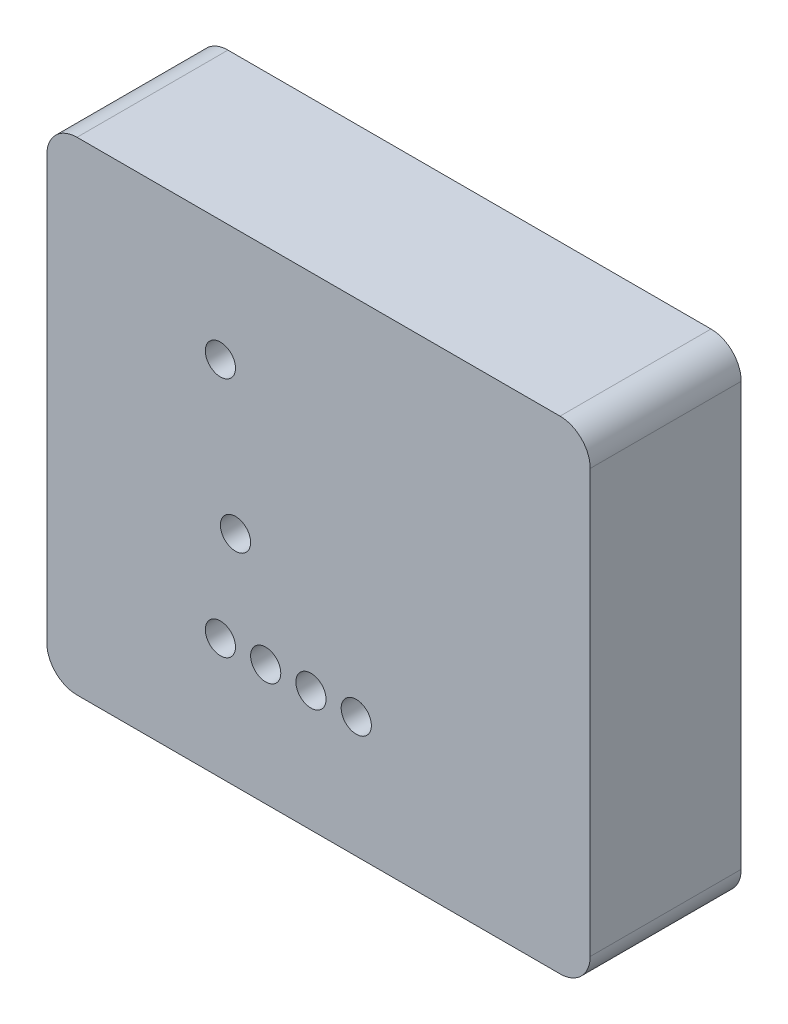
ISO-10303-21;
HEADER;
FILE_DESCRIPTION(('STEP AP214'),'2;1');
FILE_NAME('part.step','',(''),(''),'','','');
FILE_SCHEMA(('AUTOMOTIVE_DESIGN { 1 0 10303 214 1 1 1 1 }'));
ENDSEC;
DATA;
#1=APPLICATION_CONTEXT('core data for automotive mechanical design processes');
#2=APPLICATION_PROTOCOL_DEFINITION('international standard','automotive_design',2000,#1);
#3=PRODUCT_CONTEXT('',#1,'mechanical');
#4=PRODUCT('Part','Part','',(#3));
#5=PRODUCT_RELATED_PRODUCT_CATEGORY('part','',(#4));
#6=PRODUCT_DEFINITION_FORMATION('','',#4);
#7=PRODUCT_DEFINITION_CONTEXT('part definition',#1,'design');
#8=PRODUCT_DEFINITION('design','',#6,#7);
#9=PRODUCT_DEFINITION_SHAPE('','',#8);
#10=(LENGTH_UNIT() NAMED_UNIT(*) SI_UNIT(.MILLI.,.METRE.));
#11=(NAMED_UNIT(*) PLANE_ANGLE_UNIT() SI_UNIT($,.RADIAN.));
#12=(NAMED_UNIT(*) SI_UNIT($,.STERADIAN.) SOLID_ANGLE_UNIT());
#13=UNCERTAINTY_MEASURE_WITH_UNIT(LENGTH_MEASURE(1.E-05),#10,'distance_accuracy_value','');
#14=(GEOMETRIC_REPRESENTATION_CONTEXT(3) GLOBAL_UNCERTAINTY_ASSIGNED_CONTEXT((#13)) GLOBAL_UNIT_ASSIGNED_CONTEXT((#10,
#11,#12)) REPRESENTATION_CONTEXT('',''));
#15=CARTESIAN_POINT('',(0.,0.,0.));
#16=DIRECTION('',(0.,0.,1.));
#17=DIRECTION('',(1.,0.,0.));
#18=AXIS2_PLACEMENT_3D('',#15,#16,#17);
#19=CARTESIAN_POINT('',(0.,0.,5.));
#20=DIRECTION('',(0.,0.,-1.));
#21=DIRECTION('',(-1.,0.,0.));
#22=AXIS2_PLACEMENT_3D('',#19,#20,#21);
#23=PLANE('',#22);
#24=CARTESIAN_POINT('',(5.75,12.,5.));
#25=DIRECTION('',(0.,0.,1.));
#26=DIRECTION('',(1.,0.,0.));
#27=AXIS2_PLACEMENT_3D('',#24,#25,#26);
#28=CIRCLE('',#27,0.500000000000001);
#29=CARTESIAN_POINT('',(6.25,12.,5.));
#30=VERTEX_POINT('',#29);
#31=EDGE_CURVE('E199',#30,#30,#28,.T.);
#32=ORIENTED_EDGE('',*,*,#31,.F.);
#33=EDGE_LOOP('',(#32));
#34=FACE_BOUND('',#33,.T.);
#35=CARTESIAN_POINT('',(8.75,4.,5.));
#36=DIRECTION('',(0.,0.,1.));
#37=DIRECTION('',(1.,0.,0.));
#38=AXIS2_PLACEMENT_3D('',#35,#36,#37);
#39=CIRCLE('',#38,0.500000000000001);
#40=CARTESIAN_POINT('',(9.25,4.,5.));
#41=VERTEX_POINT('',#40);
#42=EDGE_CURVE('E187',#41,#41,#39,.T.);
#43=ORIENTED_EDGE('',*,*,#42,.F.);
#44=EDGE_LOOP('',(#43));
#45=FACE_BOUND('',#44,.T.);
#46=CARTESIAN_POINT('',(5.75,4.,5.));
#47=DIRECTION('',(0.,0.,1.));
#48=DIRECTION('',(1.,0.,0.));
#49=AXIS2_PLACEMENT_3D('',#46,#47,#48);
#50=CIRCLE('',#49,0.500000000000001);
#51=CARTESIAN_POINT('',(6.25,4.,5.));
#52=VERTEX_POINT('',#51);
#53=EDGE_CURVE('E120',#52,#52,#50,.T.);
#54=ORIENTED_EDGE('',*,*,#53,.F.);
#55=EDGE_LOOP('',(#54));
#56=FACE_BOUND('',#55,.T.);
#57=DIRECTION('',(1.,0.,0.));
#58=VECTOR('',#57,1.);
#59=CARTESIAN_POINT('',(0.,0.,5.));
#60=LINE('',#59,#58);
#61=CARTESIAN_POINT('',(1.,0.,5.));
#62=VERTEX_POINT('',#61);
#63=CARTESIAN_POINT('',(17.,0.,5.));
#64=VERTEX_POINT('',#63);
#65=EDGE_CURVE('E110',#62,#64,#60,.T.);
#66=ORIENTED_EDGE('',*,*,#65,.T.);
#67=CARTESIAN_POINT('',(17.,1.,5.));
#68=DIRECTION('',(0.,0.,-1.));
#69=DIRECTION('',(-1.,0.,0.));
#70=AXIS2_PLACEMENT_3D('',#67,#68,#69);
#71=CIRCLE('',#70,1.);
#72=CARTESIAN_POINT('',(18.,1.,5.));
#73=VERTEX_POINT('',#72);
#74=EDGE_CURVE('E11',#64,#73,#71,.F.);
#75=ORIENTED_EDGE('',*,*,#74,.T.);
#76=DIRECTION('',(0.,1.,0.));
#77=VECTOR('',#76,1.);
#78=CARTESIAN_POINT('',(18.,0.,5.));
#79=LINE('',#78,#77);
#80=CARTESIAN_POINT('',(18.,15.,5.));
#81=VERTEX_POINT('',#80);
#82=EDGE_CURVE('E158',#73,#81,#79,.T.);
#83=ORIENTED_EDGE('',*,*,#82,.T.);
#84=CARTESIAN_POINT('',(17.,15.,5.));
#85=DIRECTION('',(0.,0.,-1.));
#86=DIRECTION('',(-1.,0.,0.));
#87=AXIS2_PLACEMENT_3D('',#84,#85,#86);
#88=CIRCLE('',#87,1.);
#89=CARTESIAN_POINT('',(17.,16.,5.));
#90=VERTEX_POINT('',#89);
#91=EDGE_CURVE('E149',#81,#90,#88,.F.);
#92=ORIENTED_EDGE('',*,*,#91,.T.);
#93=DIRECTION('',(-1.,0.,0.));
#94=VECTOR('',#93,1.);
#95=CARTESIAN_POINT('',(0.,16.,5.));
#96=LINE('',#95,#94);
#97=CARTESIAN_POINT('',(1.,16.,5.));
#98=VERTEX_POINT('',#97);
#99=EDGE_CURVE('E111',#90,#98,#96,.T.);
#100=ORIENTED_EDGE('',*,*,#99,.T.);
#101=CARTESIAN_POINT('',(1.,15.,5.));
#102=DIRECTION('',(0.,0.,-1.));
#103=DIRECTION('',(-1.,0.,0.));
#104=AXIS2_PLACEMENT_3D('',#101,#102,#103);
#105=CIRCLE('',#104,1.);
#106=CARTESIAN_POINT('',(0.,15.,5.));
#107=VERTEX_POINT('',#106);
#108=EDGE_CURVE('E138',#98,#107,#105,.F.);
#109=ORIENTED_EDGE('',*,*,#108,.T.);
#110=DIRECTION('',(0.,-1.,0.));
#111=VECTOR('',#110,1.);
#112=CARTESIAN_POINT('',(0.,0.,5.));
#113=LINE('',#112,#111);
#114=CARTESIAN_POINT('',(0.,1.,5.));
#115=VERTEX_POINT('',#114);
#116=EDGE_CURVE('E124',#107,#115,#113,.T.);
#117=ORIENTED_EDGE('',*,*,#116,.T.);
#118=CARTESIAN_POINT('',(1.,1.,5.));
#119=DIRECTION('',(0.,0.,-1.));
#120=DIRECTION('',(-1.,0.,0.));
#121=AXIS2_PLACEMENT_3D('',#118,#119,#120);
#122=CIRCLE('',#121,1.);
#123=EDGE_CURVE('E127',#115,#62,#122,.F.);
#124=ORIENTED_EDGE('',*,*,#123,.T.);
#125=EDGE_LOOP('',(#66,#75,#83,#92,#100,#109,#117,#124));
#126=FACE_BOUND('',#125,.T.);
#127=CARTESIAN_POINT('',(7.25,4.,5.));
#128=DIRECTION('',(0.,0.,1.));
#129=DIRECTION('',(1.,0.,0.));
#130=AXIS2_PLACEMENT_3D('',#127,#128,#129);
#131=CIRCLE('',#130,0.5);
#132=CARTESIAN_POINT('',(7.75,4.,5.));
#133=VERTEX_POINT('',#132);
#134=EDGE_CURVE('E181',#133,#133,#131,.T.);
#135=ORIENTED_EDGE('',*,*,#134,.F.);
#136=EDGE_LOOP('',(#135));
#137=FACE_BOUND('',#136,.T.);
#138=CARTESIAN_POINT('',(10.25,4.,5.));
#139=DIRECTION('',(0.,0.,1.));
#140=DIRECTION('',(1.,0.,0.));
#141=AXIS2_PLACEMENT_3D('',#138,#139,#140);
#142=CIRCLE('',#141,0.500000000000001);
#143=CARTESIAN_POINT('',(10.75,4.,5.));
#144=VERTEX_POINT('',#143);
#145=EDGE_CURVE('E193',#144,#144,#142,.T.);
#146=ORIENTED_EDGE('',*,*,#145,.F.);
#147=EDGE_LOOP('',(#146));
#148=FACE_BOUND('',#147,.T.);
#149=CARTESIAN_POINT('',(6.25,7.25,5.));
#150=DIRECTION('',(0.,0.,1.));
#151=DIRECTION('',(1.,0.,0.));
#152=AXIS2_PLACEMENT_3D('',#149,#150,#151);
#153=CIRCLE('',#152,0.500000000000001);
#154=CARTESIAN_POINT('',(6.75,7.25,5.));
#155=VERTEX_POINT('',#154);
#156=EDGE_CURVE('E205',#155,#155,#153,.T.);
#157=ORIENTED_EDGE('',*,*,#156,.F.);
#158=EDGE_LOOP('',(#157));
#159=FACE_BOUND('',#158,.T.);
#160=ADVANCED_FACE('F33',(#34,#45,#56,#126,#137,#148,#159),#23,.F.);
#161=CARTESIAN_POINT('',(0.,0.,0.));
#162=DIRECTION('',(0.,0.,-1.));
#163=DIRECTION('',(-1.,0.,0.));
#164=AXIS2_PLACEMENT_3D('',#161,#162,#163);
#165=PLANE('',#164);
#166=CARTESIAN_POINT('',(5.75,12.,0.));
#167=DIRECTION('',(0.,0.,1.));
#168=DIRECTION('',(1.,0.,0.));
#169=AXIS2_PLACEMENT_3D('',#166,#167,#168);
#170=CIRCLE('',#169,0.500000000000001);
#171=CARTESIAN_POINT('',(6.25,12.,0.));
#172=VERTEX_POINT('',#171);
#173=EDGE_CURVE('E202',#172,#172,#170,.T.);
#174=ORIENTED_EDGE('',*,*,#173,.T.);
#175=EDGE_LOOP('',(#174));
#176=FACE_BOUND('',#175,.T.);
#177=CARTESIAN_POINT('',(8.75,4.,0.));
#178=DIRECTION('',(0.,0.,1.));
#179=DIRECTION('',(1.,0.,0.));
#180=AXIS2_PLACEMENT_3D('',#177,#178,#179);
#181=CIRCLE('',#180,0.500000000000001);
#182=CARTESIAN_POINT('',(9.25,4.,0.));
#183=VERTEX_POINT('',#182);
#184=EDGE_CURVE('E190',#183,#183,#181,.T.);
#185=ORIENTED_EDGE('',*,*,#184,.T.);
#186=EDGE_LOOP('',(#185));
#187=FACE_BOUND('',#186,.T.);
#188=CARTESIAN_POINT('',(5.75,4.,0.));
#189=DIRECTION('',(0.,0.,1.));
#190=DIRECTION('',(1.,0.,0.));
#191=AXIS2_PLACEMENT_3D('',#188,#189,#190);
#192=CIRCLE('',#191,0.500000000000001);
#193=CARTESIAN_POINT('',(6.25,4.,0.));
#194=VERTEX_POINT('',#193);
#195=EDGE_CURVE('E178',#194,#194,#192,.T.);
#196=ORIENTED_EDGE('',*,*,#195,.T.);
#197=EDGE_LOOP('',(#196));
#198=FACE_BOUND('',#197,.T.);
#199=DIRECTION('',(0.,1.,0.));
#200=VECTOR('',#199,1.);
#201=CARTESIAN_POINT('',(18.,0.,0.));
#202=LINE('',#201,#200);
#203=CARTESIAN_POINT('',(18.,1.,0.));
#204=VERTEX_POINT('',#203);
#205=CARTESIAN_POINT('',(18.,15.,0.));
#206=VERTEX_POINT('',#205);
#207=EDGE_CURVE('E115',#204,#206,#202,.T.);
#208=ORIENTED_EDGE('',*,*,#207,.F.);
#209=CARTESIAN_POINT('',(17.,1.,0.));
#210=DIRECTION('',(0.,0.,-1.));
#211=DIRECTION('',(-1.,0.,0.));
#212=AXIS2_PLACEMENT_3D('',#209,#210,#211);
#213=CIRCLE('',#212,1.);
#214=CARTESIAN_POINT('',(17.,0.,0.));
#215=VERTEX_POINT('',#214);
#216=EDGE_CURVE('E55',#204,#215,#213,.T.);
#217=ORIENTED_EDGE('',*,*,#216,.T.);
#218=DIRECTION('',(1.,0.,0.));
#219=VECTOR('',#218,1.);
#220=CARTESIAN_POINT('',(0.,0.,0.));
#221=LINE('',#220,#219);
#222=CARTESIAN_POINT('',(1.,0.,0.));
#223=VERTEX_POINT('',#222);
#224=EDGE_CURVE('E109',#223,#215,#221,.T.);
#225=ORIENTED_EDGE('',*,*,#224,.F.);
#226=CARTESIAN_POINT('',(1.,1.,0.));
#227=DIRECTION('',(0.,0.,-1.));
#228=DIRECTION('',(-1.,0.,0.));
#229=AXIS2_PLACEMENT_3D('',#226,#227,#228);
#230=CIRCLE('',#229,1.);
#231=CARTESIAN_POINT('',(0.,1.,0.));
#232=VERTEX_POINT('',#231);
#233=EDGE_CURVE('E99',#223,#232,#230,.T.);
#234=ORIENTED_EDGE('',*,*,#233,.T.);
#235=DIRECTION('',(0.,-1.,0.));
#236=VECTOR('',#235,1.);
#237=CARTESIAN_POINT('',(0.,0.,0.));
#238=LINE('',#237,#236);
#239=CARTESIAN_POINT('',(0.,15.,0.));
#240=VERTEX_POINT('',#239);
#241=EDGE_CURVE('E116',#240,#232,#238,.T.);
#242=ORIENTED_EDGE('',*,*,#241,.F.);
#243=CARTESIAN_POINT('',(1.,15.,0.));
#244=DIRECTION('',(0.,0.,-1.));
#245=DIRECTION('',(-1.,0.,0.));
#246=AXIS2_PLACEMENT_3D('',#243,#244,#245);
#247=CIRCLE('',#246,1.);
#248=CARTESIAN_POINT('',(1.,16.,0.));
#249=VERTEX_POINT('',#248);
#250=EDGE_CURVE('E132',#240,#249,#247,.T.);
#251=ORIENTED_EDGE('',*,*,#250,.T.);
#252=DIRECTION('',(-1.,0.,0.));
#253=VECTOR('',#252,1.);
#254=CARTESIAN_POINT('',(0.,16.,0.));
#255=LINE('',#254,#253);
#256=CARTESIAN_POINT('',(17.,16.,0.));
#257=VERTEX_POINT('',#256);
#258=EDGE_CURVE('E118',#257,#249,#255,.T.);
#259=ORIENTED_EDGE('',*,*,#258,.F.);
#260=CARTESIAN_POINT('',(17.,15.,0.));
#261=DIRECTION('',(0.,0.,-1.));
#262=DIRECTION('',(-1.,0.,0.));
#263=AXIS2_PLACEMENT_3D('',#260,#261,#262);
#264=CIRCLE('',#263,1.);
#265=EDGE_CURVE('E143',#257,#206,#264,.T.);
#266=ORIENTED_EDGE('',*,*,#265,.T.);
#267=EDGE_LOOP('',(#208,#217,#225,#234,#242,#251,#259,#266));
#268=FACE_BOUND('',#267,.T.);
#269=CARTESIAN_POINT('',(7.25,4.,0.));
#270=DIRECTION('',(0.,0.,1.));
#271=DIRECTION('',(1.,0.,0.));
#272=AXIS2_PLACEMENT_3D('',#269,#270,#271);
#273=CIRCLE('',#272,0.5);
#274=CARTESIAN_POINT('',(7.75,4.,0.));
#275=VERTEX_POINT('',#274);
#276=EDGE_CURVE('E184',#275,#275,#273,.T.);
#277=ORIENTED_EDGE('',*,*,#276,.T.);
#278=EDGE_LOOP('',(#277));
#279=FACE_BOUND('',#278,.T.);
#280=CARTESIAN_POINT('',(10.25,4.,0.));
#281=DIRECTION('',(0.,0.,1.));
#282=DIRECTION('',(1.,0.,0.));
#283=AXIS2_PLACEMENT_3D('',#280,#281,#282);
#284=CIRCLE('',#283,0.500000000000001);
#285=CARTESIAN_POINT('',(10.75,4.,0.));
#286=VERTEX_POINT('',#285);
#287=EDGE_CURVE('E196',#286,#286,#284,.T.);
#288=ORIENTED_EDGE('',*,*,#287,.T.);
#289=EDGE_LOOP('',(#288));
#290=FACE_BOUND('',#289,.T.);
#291=CARTESIAN_POINT('',(6.25,7.25,0.));
#292=DIRECTION('',(0.,0.,1.));
#293=DIRECTION('',(1.,0.,0.));
#294=AXIS2_PLACEMENT_3D('',#291,#292,#293);
#295=CIRCLE('',#294,0.500000000000001);
#296=CARTESIAN_POINT('',(6.75,7.25,0.));
#297=VERTEX_POINT('',#296);
#298=EDGE_CURVE('E208',#297,#297,#295,.T.);
#299=ORIENTED_EDGE('',*,*,#298,.T.);
#300=EDGE_LOOP('',(#299));
#301=FACE_BOUND('',#300,.T.);
#302=ADVANCED_FACE('F113',(#176,#187,#198,#268,#279,#290,#301),#165,.T.);
#303=CARTESIAN_POINT('',(0.,0.,5.));
#304=DIRECTION('',(1.,0.,0.));
#305=DIRECTION('',(0.,0.,-1.));
#306=AXIS2_PLACEMENT_3D('',#303,#304,#305);
#307=PLANE('',#306);
#308=ORIENTED_EDGE('',*,*,#116,.F.);
#309=DIRECTION('',(0.,0.,-1.));
#310=VECTOR('',#309,1.);
#311=CARTESIAN_POINT('',(0.,15.,5.));
#312=LINE('',#311,#310);
#313=EDGE_CURVE('E129',#107,#240,#312,.T.);
#314=ORIENTED_EDGE('',*,*,#313,.T.);
#315=ORIENTED_EDGE('',*,*,#241,.T.);
#316=DIRECTION('',(0.,0.,-1.));
#317=VECTOR('',#316,1.);
#318=CARTESIAN_POINT('',(0.,1.,5.));
#319=LINE('',#318,#317);
#320=EDGE_CURVE('E105',#232,#115,#319,.F.);
#321=ORIENTED_EDGE('',*,*,#320,.T.);
#322=EDGE_LOOP('',(#308,#314,#315,#321));
#323=FACE_BOUND('',#322,.T.);
#324=ADVANCED_FACE('F223',(#323),#307,.F.);
#325=CARTESIAN_POINT('',(0.,0.,5.));
#326=DIRECTION('',(0.,1.,0.));
#327=DIRECTION('',(0.,0.,1.));
#328=AXIS2_PLACEMENT_3D('',#325,#326,#327);
#329=PLANE('',#328);
#330=ORIENTED_EDGE('',*,*,#224,.T.);
#331=DIRECTION('',(0.,0.,-1.));
#332=VECTOR('',#331,1.);
#333=CARTESIAN_POINT('',(17.,0.,5.));
#334=LINE('',#333,#332);
#335=EDGE_CURVE('E41',#215,#64,#334,.F.);
#336=ORIENTED_EDGE('',*,*,#335,.T.);
#337=ORIENTED_EDGE('',*,*,#65,.F.);
#338=DIRECTION('',(0.,0.,-1.));
#339=VECTOR('',#338,1.);
#340=CARTESIAN_POINT('',(1.,0.,5.));
#341=LINE('',#340,#339);
#342=EDGE_CURVE('E103',#62,#223,#341,.T.);
#343=ORIENTED_EDGE('',*,*,#342,.T.);
#344=EDGE_LOOP('',(#330,#336,#337,#343));
#345=FACE_BOUND('',#344,.T.);
#346=ADVANCED_FACE('F108',(#345),#329,.F.);
#347=CARTESIAN_POINT('',(18.,0.,5.));
#348=DIRECTION('',(-1.,0.,0.));
#349=DIRECTION('',(0.,0.,1.));
#350=AXIS2_PLACEMENT_3D('',#347,#348,#349);
#351=PLANE('',#350);
#352=ORIENTED_EDGE('',*,*,#82,.F.);
#353=DIRECTION('',(0.,0.,-1.));
#354=VECTOR('',#353,1.);
#355=CARTESIAN_POINT('',(18.,1.,5.));
#356=LINE('',#355,#354);
#357=EDGE_CURVE('E151',#73,#204,#356,.T.);
#358=ORIENTED_EDGE('',*,*,#357,.T.);
#359=ORIENTED_EDGE('',*,*,#207,.T.);
#360=DIRECTION('',(0.,0.,-1.));
#361=VECTOR('',#360,1.);
#362=CARTESIAN_POINT('',(18.,15.,5.));
#363=LINE('',#362,#361);
#364=EDGE_CURVE('E146',#206,#81,#363,.F.);
#365=ORIENTED_EDGE('',*,*,#364,.T.);
#366=EDGE_LOOP('',(#352,#358,#359,#365));
#367=FACE_BOUND('',#366,.T.);
#368=ADVANCED_FACE('F157',(#367),#351,.F.);
#369=CARTESIAN_POINT('',(0.,16.,5.));
#370=DIRECTION('',(0.,-1.,0.));
#371=DIRECTION('',(0.,0.,-1.));
#372=AXIS2_PLACEMENT_3D('',#369,#370,#371);
#373=PLANE('',#372);
#374=ORIENTED_EDGE('',*,*,#99,.F.);
#375=DIRECTION('',(0.,0.,-1.));
#376=VECTOR('',#375,1.);
#377=CARTESIAN_POINT('',(17.,16.,5.));
#378=LINE('',#377,#376);
#379=EDGE_CURVE('E140',#90,#257,#378,.T.);
#380=ORIENTED_EDGE('',*,*,#379,.T.);
#381=ORIENTED_EDGE('',*,*,#258,.T.);
#382=DIRECTION('',(0.,0.,-1.));
#383=VECTOR('',#382,1.);
#384=CARTESIAN_POINT('',(1.,16.,5.));
#385=LINE('',#384,#383);
#386=EDGE_CURVE('E135',#249,#98,#385,.F.);
#387=ORIENTED_EDGE('',*,*,#386,.T.);
#388=EDGE_LOOP('',(#374,#380,#381,#387));
#389=FACE_BOUND('',#388,.T.);
#390=ADVANCED_FACE('F171',(#389),#373,.F.);
#391=CARTESIAN_POINT('',(5.75,4.,5.));
#392=DIRECTION('',(0.,0.,-1.));
#393=DIRECTION('',(-1.,0.,0.));
#394=AXIS2_PLACEMENT_3D('',#391,#392,#393);
#395=CYLINDRICAL_SURFACE('',#394,0.500000000000001);
#396=ORIENTED_EDGE('',*,*,#53,.T.);
#397=EDGE_LOOP('',(#396));
#398=FACE_BOUND('',#397,.T.);
#399=ORIENTED_EDGE('',*,*,#195,.F.);
#400=EDGE_LOOP('',(#399));
#401=FACE_BOUND('',#400,.T.);
#402=ADVANCED_FACE('F229',(#398,#401),#395,.F.);
#403=CARTESIAN_POINT('',(7.25,4.,5.));
#404=DIRECTION('',(0.,0.,-1.));
#405=DIRECTION('',(-1.,0.,0.));
#406=AXIS2_PLACEMENT_3D('',#403,#404,#405);
#407=CYLINDRICAL_SURFACE('',#406,0.5);
#408=ORIENTED_EDGE('',*,*,#134,.T.);
#409=EDGE_LOOP('',(#408));
#410=FACE_BOUND('',#409,.T.);
#411=ORIENTED_EDGE('',*,*,#276,.F.);
#412=EDGE_LOOP('',(#411));
#413=FACE_BOUND('',#412,.T.);
#414=ADVANCED_FACE('F344',(#410,#413),#407,.F.);
#415=CARTESIAN_POINT('',(8.75,4.,5.));
#416=DIRECTION('',(0.,0.,-1.));
#417=DIRECTION('',(-1.,0.,0.));
#418=AXIS2_PLACEMENT_3D('',#415,#416,#417);
#419=CYLINDRICAL_SURFACE('',#418,0.500000000000001);
#420=ORIENTED_EDGE('',*,*,#42,.T.);
#421=EDGE_LOOP('',(#420));
#422=FACE_BOUND('',#421,.T.);
#423=ORIENTED_EDGE('',*,*,#184,.F.);
#424=EDGE_LOOP('',(#423));
#425=FACE_BOUND('',#424,.T.);
#426=ADVANCED_FACE('F334',(#422,#425),#419,.F.);
#427=CARTESIAN_POINT('',(10.25,4.,5.));
#428=DIRECTION('',(0.,0.,-1.));
#429=DIRECTION('',(-1.,0.,0.));
#430=AXIS2_PLACEMENT_3D('',#427,#428,#429);
#431=CYLINDRICAL_SURFACE('',#430,0.500000000000001);
#432=ORIENTED_EDGE('',*,*,#145,.T.);
#433=EDGE_LOOP('',(#432));
#434=FACE_BOUND('',#433,.T.);
#435=ORIENTED_EDGE('',*,*,#287,.F.);
#436=EDGE_LOOP('',(#435));
#437=FACE_BOUND('',#436,.T.);
#438=ADVANCED_FACE('F324',(#434,#437),#431,.F.);
#439=CARTESIAN_POINT('',(5.75,12.,5.));
#440=DIRECTION('',(0.,0.,-1.));
#441=DIRECTION('',(-1.,0.,0.));
#442=AXIS2_PLACEMENT_3D('',#439,#440,#441);
#443=CYLINDRICAL_SURFACE('',#442,0.500000000000001);
#444=ORIENTED_EDGE('',*,*,#31,.T.);
#445=EDGE_LOOP('',(#444));
#446=FACE_BOUND('',#445,.T.);
#447=ORIENTED_EDGE('',*,*,#173,.F.);
#448=EDGE_LOOP('',(#447));
#449=FACE_BOUND('',#448,.T.);
#450=ADVANCED_FACE('F315',(#446,#449),#443,.F.);
#451=CARTESIAN_POINT('',(6.25,7.25,5.));
#452=DIRECTION('',(0.,0.,-1.));
#453=DIRECTION('',(-1.,0.,0.));
#454=AXIS2_PLACEMENT_3D('',#451,#452,#453);
#455=CYLINDRICAL_SURFACE('',#454,0.500000000000001);
#456=ORIENTED_EDGE('',*,*,#156,.T.);
#457=EDGE_LOOP('',(#456));
#458=FACE_BOUND('',#457,.T.);
#459=ORIENTED_EDGE('',*,*,#298,.F.);
#460=EDGE_LOOP('',(#459));
#461=FACE_BOUND('',#460,.T.);
#462=ADVANCED_FACE('F214',(#458,#461),#455,.F.);
#463=CARTESIAN_POINT('',(1.,1.,5.));
#464=DIRECTION('',(0.,0.,-1.));
#465=DIRECTION('',(-1.,0.,0.));
#466=AXIS2_PLACEMENT_3D('',#463,#464,#465);
#467=CYLINDRICAL_SURFACE('',#466,1.);
#468=ORIENTED_EDGE('',*,*,#123,.F.);
#469=ORIENTED_EDGE('',*,*,#320,.F.);
#470=ORIENTED_EDGE('',*,*,#233,.F.);
#471=ORIENTED_EDGE('',*,*,#342,.F.);
#472=EDGE_LOOP('',(#468,#469,#470,#471));
#473=FACE_BOUND('',#472,.T.);
#474=ADVANCED_FACE('F102',(#473),#467,.T.);
#475=CARTESIAN_POINT('',(1.,15.,5.));
#476=DIRECTION('',(0.,0.,-1.));
#477=DIRECTION('',(-1.,0.,0.));
#478=AXIS2_PLACEMENT_3D('',#475,#476,#477);
#479=CYLINDRICAL_SURFACE('',#478,1.);
#480=ORIENTED_EDGE('',*,*,#108,.F.);
#481=ORIENTED_EDGE('',*,*,#386,.F.);
#482=ORIENTED_EDGE('',*,*,#250,.F.);
#483=ORIENTED_EDGE('',*,*,#313,.F.);
#484=EDGE_LOOP('',(#480,#481,#482,#483));
#485=FACE_BOUND('',#484,.T.);
#486=ADVANCED_FACE('F243',(#485),#479,.T.);
#487=CARTESIAN_POINT('',(17.,15.,5.));
#488=DIRECTION('',(0.,0.,-1.));
#489=DIRECTION('',(-1.,0.,0.));
#490=AXIS2_PLACEMENT_3D('',#487,#488,#489);
#491=CYLINDRICAL_SURFACE('',#490,1.);
#492=ORIENTED_EDGE('',*,*,#91,.F.);
#493=ORIENTED_EDGE('',*,*,#364,.F.);
#494=ORIENTED_EDGE('',*,*,#265,.F.);
#495=ORIENTED_EDGE('',*,*,#379,.F.);
#496=EDGE_LOOP('',(#492,#493,#494,#495));
#497=FACE_BOUND('',#496,.T.);
#498=ADVANCED_FACE('F166',(#497),#491,.T.);
#499=CARTESIAN_POINT('',(17.,1.,5.));
#500=DIRECTION('',(0.,0.,-1.));
#501=DIRECTION('',(-1.,0.,0.));
#502=AXIS2_PLACEMENT_3D('',#499,#500,#501);
#503=CYLINDRICAL_SURFACE('',#502,1.);
#504=ORIENTED_EDGE('',*,*,#74,.F.);
#505=ORIENTED_EDGE('',*,*,#335,.F.);
#506=ORIENTED_EDGE('',*,*,#216,.F.);
#507=ORIENTED_EDGE('',*,*,#357,.F.);
#508=EDGE_LOOP('',(#504,#505,#506,#507));
#509=FACE_BOUND('',#508,.T.);
#510=ADVANCED_FACE('F35',(#509),#503,.T.);
#511=CLOSED_SHELL('',(#160,#302,#324,#346,#368,#390,#402,#414,#426,#438,#450,#462,#474,#486,
#498,#510));
#512=MANIFOLD_SOLID_BREP('B2',#511);
#513=ADVANCED_BREP_SHAPE_REPRESENTATION('',(#18,#512),#14);
#514=SHAPE_DEFINITION_REPRESENTATION(#9,#513);
ENDSEC;
END-ISO-10303-21;
